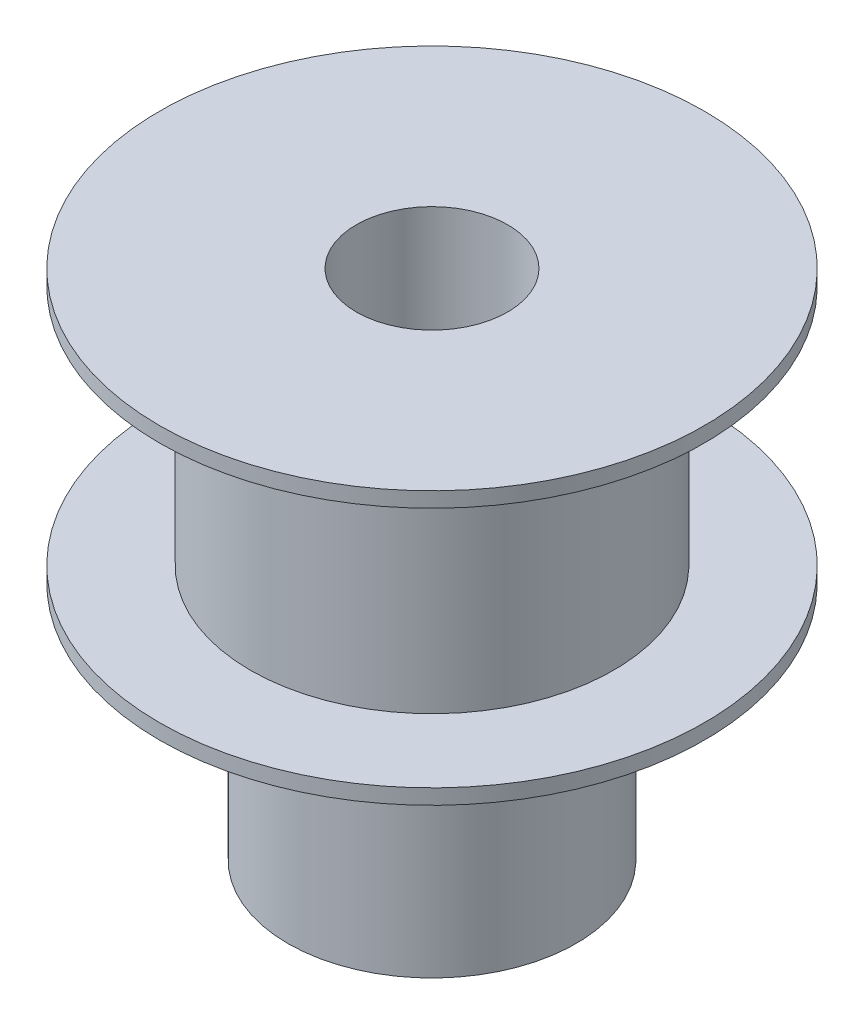
ISO-10303-21;
HEADER;
FILE_DESCRIPTION(('STEP AP214'),'2;1');
FILE_NAME('part.step','',(''),(''),'','','');
FILE_SCHEMA(('AUTOMOTIVE_DESIGN { 1 0 10303 214 1 1 1 1 }'));
ENDSEC;
DATA;
#1=APPLICATION_CONTEXT('core data for automotive mechanical design processes');
#2=APPLICATION_PROTOCOL_DEFINITION('international standard','automotive_design',2000,#1);
#3=PRODUCT_CONTEXT('',#1,'mechanical');
#4=PRODUCT('Part','Part','',(#3));
#5=PRODUCT_RELATED_PRODUCT_CATEGORY('part','',(#4));
#6=PRODUCT_DEFINITION_FORMATION('','',#4);
#7=PRODUCT_DEFINITION_CONTEXT('part definition',#1,'design');
#8=PRODUCT_DEFINITION('design','',#6,#7);
#9=PRODUCT_DEFINITION_SHAPE('','',#8);
#10=(LENGTH_UNIT() NAMED_UNIT(*) SI_UNIT(.MILLI.,.METRE.));
#11=(NAMED_UNIT(*) PLANE_ANGLE_UNIT() SI_UNIT($,.RADIAN.));
#12=(NAMED_UNIT(*) SI_UNIT($,.STERADIAN.) SOLID_ANGLE_UNIT());
#13=UNCERTAINTY_MEASURE_WITH_UNIT(LENGTH_MEASURE(1.E-05),#10,'distance_accuracy_value','');
#14=(GEOMETRIC_REPRESENTATION_CONTEXT(3) GLOBAL_UNCERTAINTY_ASSIGNED_CONTEXT((#13)) GLOBAL_UNIT_ASSIGNED_CONTEXT((#10,
#11,#12)) REPRESENTATION_CONTEXT('',''));
#15=CARTESIAN_POINT('',(0.,0.,0.));
#16=DIRECTION('',(0.,0.,1.));
#17=DIRECTION('',(1.,0.,0.));
#18=AXIS2_PLACEMENT_3D('',#15,#16,#17);
#19=CARTESIAN_POINT('',(0.,12.96875,0.));
#20=DIRECTION('',(0.,-1.,0.));
#21=DIRECTION('',(0.,0.,-1.));
#22=AXIS2_PLACEMENT_3D('',#19,#20,#21);
#23=CYLINDRICAL_SURFACE('',#22,9.);
#24=CARTESIAN_POINT('',(0.,3.96875,0.));
#25=DIRECTION('',(0.,1.,0.));
#26=DIRECTION('',(0.,0.,1.));
#27=AXIS2_PLACEMENT_3D('',#24,#25,#26);
#28=CIRCLE('',#27,9.);
#29=CARTESIAN_POINT('',(0.,3.96875,9.));
#30=VERTEX_POINT('',#29);
#31=EDGE_CURVE('E60',#30,#30,#28,.T.);
#32=ORIENTED_EDGE('',*,*,#31,.T.);
#33=EDGE_LOOP('',(#32));
#34=FACE_BOUND('',#33,.T.);
#35=CARTESIAN_POINT('',(0.,4.46875,0.));
#36=DIRECTION('',(0.,1.,0.));
#37=DIRECTION('',(0.,0.,1.));
#38=AXIS2_PLACEMENT_3D('',#35,#36,#37);
#39=CIRCLE('',#38,9.);
#40=CARTESIAN_POINT('',(0.,4.46875,9.));
#41=VERTEX_POINT('',#40);
#42=EDGE_CURVE('E68',#41,#41,#39,.T.);
#43=ORIENTED_EDGE('',*,*,#42,.F.);
#44=EDGE_LOOP('',(#43));
#45=FACE_BOUND('',#44,.T.);
#46=ADVANCED_FACE('F44',(#34,#45),#23,.T.);
#47=CARTESIAN_POINT('',(0.,12.96875,0.));
#48=DIRECTION('',(0.,1.,0.));
#49=DIRECTION('',(0.,0.,1.));
#50=AXIS2_PLACEMENT_3D('',#47,#48,#49);
#51=CIRCLE('',#50,9.);
#52=CARTESIAN_POINT('',(0.,12.96875,9.));
#53=VERTEX_POINT('',#52);
#54=EDGE_CURVE('E59',#53,#53,#51,.T.);
#55=ORIENTED_EDGE('',*,*,#54,.F.);
#56=EDGE_LOOP('',(#55));
#57=FACE_BOUND('',#56,.T.);
#58=CARTESIAN_POINT('',(0.,12.46875,0.));
#59=DIRECTION('',(0.,1.,0.));
#60=DIRECTION('',(0.,0.,1.));
#61=AXIS2_PLACEMENT_3D('',#58,#59,#60);
#62=CIRCLE('',#61,9.);
#63=CARTESIAN_POINT('',(0.,12.46875,9.));
#64=VERTEX_POINT('',#63);
#65=EDGE_CURVE('E77',#64,#64,#62,.T.);
#66=ORIENTED_EDGE('',*,*,#65,.T.);
#67=EDGE_LOOP('',(#66));
#68=FACE_BOUND('',#67,.T.);
#69=ADVANCED_FACE('F81',(#57,#68),#23,.T.);
#70=CARTESIAN_POINT('',(0.,-3.96875,0.));
#71=DIRECTION('',(0.,1.,0.));
#72=DIRECTION('',(0.,0.,1.));
#73=AXIS2_PLACEMENT_3D('',#70,#71,#72);
#74=PLANE('',#73);
#75=CARTESIAN_POINT('',(0.,-3.96875,0.));
#76=DIRECTION('',(0.,1.,0.));
#77=DIRECTION('',(0.,0.,1.));
#78=AXIS2_PLACEMENT_3D('',#75,#76,#77);
#79=CIRCLE('',#78,4.7625);
#80=CARTESIAN_POINT('',(0.,-3.96875,4.7625));
#81=VERTEX_POINT('',#80);
#82=EDGE_CURVE('E48',#81,#81,#79,.T.);
#83=ORIENTED_EDGE('',*,*,#82,.F.);
#84=EDGE_LOOP('',(#83));
#85=FACE_BOUND('',#84,.T.);
#86=CARTESIAN_POINT('',(0.,-3.96875,0.));
#87=DIRECTION('',(0.,1.,0.));
#88=DIRECTION('',(0.,0.,1.));
#89=AXIS2_PLACEMENT_3D('',#86,#87,#88);
#90=CIRCLE('',#89,2.5);
#91=CARTESIAN_POINT('',(0.,-3.96875,2.5));
#92=VERTEX_POINT('',#91);
#93=EDGE_CURVE('E55',#92,#92,#90,.T.);
#94=ORIENTED_EDGE('',*,*,#93,.T.);
#95=EDGE_LOOP('',(#94));
#96=FACE_BOUND('',#95,.T.);
#97=ADVANCED_FACE('F101',(#85,#96),#74,.F.);
#98=CARTESIAN_POINT('',(0.,3.96875,0.));
#99=DIRECTION('',(0.,-1.,0.));
#100=DIRECTION('',(0.,0.,-1.));
#101=AXIS2_PLACEMENT_3D('',#98,#99,#100);
#102=CYLINDRICAL_SURFACE('',#101,4.7625);
#103=CARTESIAN_POINT('',(0.,3.96875,0.));
#104=DIRECTION('',(0.,1.,0.));
#105=DIRECTION('',(0.,0.,1.));
#106=AXIS2_PLACEMENT_3D('',#103,#104,#105);
#107=CIRCLE('',#106,4.7625);
#108=CARTESIAN_POINT('',(0.,3.96875,4.7625));
#109=VERTEX_POINT('',#108);
#110=EDGE_CURVE('E10',#109,#109,#107,.T.);
#111=ORIENTED_EDGE('',*,*,#110,.F.);
#112=EDGE_LOOP('',(#111));
#113=FACE_BOUND('',#112,.T.);
#114=ORIENTED_EDGE('',*,*,#82,.T.);
#115=EDGE_LOOP('',(#114));
#116=FACE_BOUND('',#115,.T.);
#117=ADVANCED_FACE('F46',(#113,#116),#102,.T.);
#118=CARTESIAN_POINT('',(0.,3.96875,0.));
#119=DIRECTION('',(0.,-1.,0.));
#120=DIRECTION('',(0.,0.,-1.));
#121=AXIS2_PLACEMENT_3D('',#118,#119,#120);
#122=CYLINDRICAL_SURFACE('',#121,2.5);
#123=ORIENTED_EDGE('',*,*,#93,.F.);
#124=EDGE_LOOP('',(#123));
#125=FACE_BOUND('',#124,.T.);
#126=CARTESIAN_POINT('',(0.,12.96875,0.));
#127=DIRECTION('',(0.,1.,0.));
#128=DIRECTION('',(0.,0.,1.));
#129=AXIS2_PLACEMENT_3D('',#126,#127,#128);
#130=CIRCLE('',#129,2.5);
#131=CARTESIAN_POINT('',(0.,12.96875,2.5));
#132=VERTEX_POINT('',#131);
#133=EDGE_CURVE('E63',#132,#132,#130,.T.);
#134=ORIENTED_EDGE('',*,*,#133,.T.);
#135=EDGE_LOOP('',(#134));
#136=FACE_BOUND('',#135,.T.);
#137=ADVANCED_FACE('F108',(#125,#136),#122,.F.);
#138=CARTESIAN_POINT('',(0.,12.96875,0.));
#139=DIRECTION('',(0.,1.,0.));
#140=DIRECTION('',(0.,0.,1.));
#141=AXIS2_PLACEMENT_3D('',#138,#139,#140);
#142=PLANE('',#141);
#143=ORIENTED_EDGE('',*,*,#54,.T.);
#144=EDGE_LOOP('',(#143));
#145=FACE_BOUND('',#144,.T.);
#146=ORIENTED_EDGE('',*,*,#133,.F.);
#147=EDGE_LOOP('',(#146));
#148=FACE_BOUND('',#147,.T.);
#149=ADVANCED_FACE('F110',(#145,#148),#142,.T.);
#150=CARTESIAN_POINT('',(0.,3.96875,0.));
#151=DIRECTION('',(0.,1.,0.));
#152=DIRECTION('',(0.,0.,1.));
#153=AXIS2_PLACEMENT_3D('',#150,#151,#152);
#154=PLANE('',#153);
#155=ORIENTED_EDGE('',*,*,#110,.T.);
#156=EDGE_LOOP('',(#155));
#157=FACE_BOUND('',#156,.T.);
#158=ORIENTED_EDGE('',*,*,#31,.F.);
#159=EDGE_LOOP('',(#158));
#160=FACE_BOUND('',#159,.T.);
#161=ADVANCED_FACE('F106',(#157,#160),#154,.F.);
#162=CARTESIAN_POINT('',(0.,4.46875,-9.));
#163=DIRECTION('',(0.,1.,0.));
#164=DIRECTION('',(0.,0.,1.));
#165=AXIS2_PLACEMENT_3D('',#162,#163,#164);
#166=PLANE('',#165);
#167=ORIENTED_EDGE('',*,*,#42,.T.);
#168=EDGE_LOOP('',(#167));
#169=FACE_BOUND('',#168,.T.);
#170=CARTESIAN_POINT('',(0.,4.46875,0.));
#171=DIRECTION('',(0.,1.,0.));
#172=DIRECTION('',(0.,0.,1.));
#173=AXIS2_PLACEMENT_3D('',#170,#171,#172);
#174=CIRCLE('',#173,6.);
#175=CARTESIAN_POINT('',(0.,4.46875,6.));
#176=VERTEX_POINT('',#175);
#177=EDGE_CURVE('E71',#176,#176,#174,.T.);
#178=ORIENTED_EDGE('',*,*,#177,.F.);
#179=EDGE_LOOP('',(#178));
#180=FACE_BOUND('',#179,.T.);
#181=ADVANCED_FACE('F91',(#169,#180),#166,.T.);
#182=CARTESIAN_POINT('',(0.,12.96875,0.));
#183=DIRECTION('',(0.,1.,0.));
#184=DIRECTION('',(0.,0.,1.));
#185=AXIS2_PLACEMENT_3D('',#182,#183,#184);
#186=CYLINDRICAL_SURFACE('',#185,6.);
#187=ORIENTED_EDGE('',*,*,#177,.T.);
#188=EDGE_LOOP('',(#187));
#189=FACE_BOUND('',#188,.T.);
#190=CARTESIAN_POINT('',(0.,12.46875,0.));
#191=DIRECTION('',(0.,1.,0.));
#192=DIRECTION('',(0.,0.,1.));
#193=AXIS2_PLACEMENT_3D('',#190,#191,#192);
#194=CIRCLE('',#193,6.);
#195=CARTESIAN_POINT('',(0.,12.46875,6.));
#196=VERTEX_POINT('',#195);
#197=EDGE_CURVE('E74',#196,#196,#194,.T.);
#198=ORIENTED_EDGE('',*,*,#197,.F.);
#199=EDGE_LOOP('',(#198));
#200=FACE_BOUND('',#199,.T.);
#201=ADVANCED_FACE('F85',(#189,#200),#186,.T.);
#202=CARTESIAN_POINT('',(0.,12.46875,-9.));
#203=DIRECTION('',(0.,-1.,0.));
#204=DIRECTION('',(0.,0.,-1.));
#205=AXIS2_PLACEMENT_3D('',#202,#203,#204);
#206=PLANE('',#205);
#207=ORIENTED_EDGE('',*,*,#197,.T.);
#208=EDGE_LOOP('',(#207));
#209=FACE_BOUND('',#208,.T.);
#210=ORIENTED_EDGE('',*,*,#65,.F.);
#211=EDGE_LOOP('',(#210));
#212=FACE_BOUND('',#211,.T.);
#213=ADVANCED_FACE('F83',(#209,#212),#206,.T.);
#214=CLOSED_SHELL('',(#46,#69,#97,#117,#137,#149,#161,#181,#201,#213));
#215=MANIFOLD_SOLID_BREP('B2',#214);
#216=ADVANCED_BREP_SHAPE_REPRESENTATION('',(#18,#215),#14);
#217=SHAPE_DEFINITION_REPRESENTATION(#9,#216);
ENDSEC;
END-ISO-10303-21;
